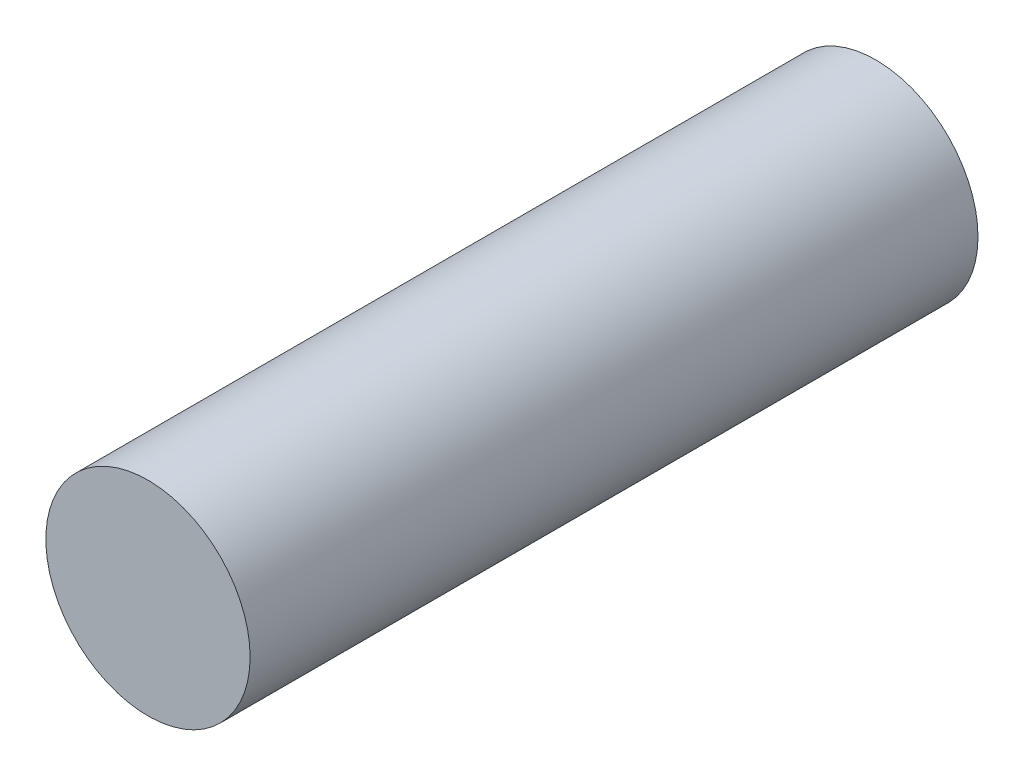
ISO-10303-21;
HEADER;
FILE_DESCRIPTION(('STEP AP214'),'2;1');
FILE_NAME('part.step','',(''),(''),'','','');
FILE_SCHEMA(('AUTOMOTIVE_DESIGN { 1 0 10303 214 1 1 1 1 }'));
ENDSEC;
DATA;
#1=APPLICATION_CONTEXT('core data for automotive mechanical design processes');
#2=APPLICATION_PROTOCOL_DEFINITION('international standard','automotive_design',2000,#1);
#3=PRODUCT_CONTEXT('',#1,'mechanical');
#4=PRODUCT('Part','Part','',(#3));
#5=PRODUCT_RELATED_PRODUCT_CATEGORY('part','',(#4));
#6=PRODUCT_DEFINITION_FORMATION('','',#4);
#7=PRODUCT_DEFINITION_CONTEXT('part definition',#1,'design');
#8=PRODUCT_DEFINITION('design','',#6,#7);
#9=PRODUCT_DEFINITION_SHAPE('','',#8);
#10=(LENGTH_UNIT() NAMED_UNIT(*) SI_UNIT(.MILLI.,.METRE.));
#11=(NAMED_UNIT(*) PLANE_ANGLE_UNIT() SI_UNIT($,.RADIAN.));
#12=(NAMED_UNIT(*) SI_UNIT($,.STERADIAN.) SOLID_ANGLE_UNIT());
#13=UNCERTAINTY_MEASURE_WITH_UNIT(LENGTH_MEASURE(1.E-05),#10,'distance_accuracy_value','');
#14=(GEOMETRIC_REPRESENTATION_CONTEXT(3) GLOBAL_UNCERTAINTY_ASSIGNED_CONTEXT((#13)) GLOBAL_UNIT_ASSIGNED_CONTEXT((#10,
#11,#12)) REPRESENTATION_CONTEXT('',''));
#15=CARTESIAN_POINT('',(0.,0.,0.));
#16=DIRECTION('',(0.,0.,1.));
#17=DIRECTION('',(1.,0.,0.));
#18=AXIS2_PLACEMENT_3D('',#15,#16,#17);
#19=CARTESIAN_POINT('',(0.,0.,64.14));
#20=DIRECTION('',(0.,0.,-1.));
#21=DIRECTION('',(-1.,0.,0.));
#22=AXIS2_PLACEMENT_3D('',#19,#20,#21);
#23=CYLINDRICAL_SURFACE('',#22,9.);
#24=CARTESIAN_POINT('',(0.,0.,64.14));
#25=DIRECTION('',(0.,0.,1.));
#26=DIRECTION('',(1.,0.,0.));
#27=AXIS2_PLACEMENT_3D('',#24,#25,#26);
#28=CIRCLE('',#27,9.);
#29=CARTESIAN_POINT('',(9.,0.,64.14));
#30=VERTEX_POINT('',#29);
#31=EDGE_CURVE('E10',#30,#30,#28,.T.);
#32=ORIENTED_EDGE('',*,*,#31,.F.);
#33=EDGE_LOOP('',(#32));
#34=FACE_BOUND('',#33,.T.);
#35=CARTESIAN_POINT('',(0.,0.,0.));
#36=DIRECTION('',(0.,0.,1.));
#37=DIRECTION('',(1.,0.,0.));
#38=AXIS2_PLACEMENT_3D('',#35,#36,#37);
#39=CIRCLE('',#38,9.);
#40=CARTESIAN_POINT('',(9.,0.,0.));
#41=VERTEX_POINT('',#40);
#42=EDGE_CURVE('E44',#41,#41,#39,.T.);
#43=ORIENTED_EDGE('',*,*,#42,.T.);
#44=EDGE_LOOP('',(#43));
#45=FACE_BOUND('',#44,.T.);
#46=ADVANCED_FACE('F45',(#34,#45),#23,.T.);
#47=CARTESIAN_POINT('',(0.,0.,64.14));
#48=DIRECTION('',(0.,0.,1.));
#49=DIRECTION('',(1.,0.,0.));
#50=AXIS2_PLACEMENT_3D('',#47,#48,#49);
#51=PLANE('',#50);
#52=ORIENTED_EDGE('',*,*,#31,.T.);
#53=EDGE_LOOP('',(#52));
#54=FACE_BOUND('',#53,.T.);
#55=ADVANCED_FACE('F60',(#54),#51,.T.);
#56=CARTESIAN_POINT('',(0.,0.,0.));
#57=DIRECTION('',(0.,0.,1.));
#58=DIRECTION('',(1.,0.,0.));
#59=AXIS2_PLACEMENT_3D('',#56,#57,#58);
#60=PLANE('',#59);
#61=ORIENTED_EDGE('',*,*,#42,.F.);
#62=EDGE_LOOP('',(#61));
#63=FACE_BOUND('',#62,.T.);
#64=ADVANCED_FACE('F54',(#63),#60,.F.);
#65=CLOSED_SHELL('',(#46,#55,#64));
#66=MANIFOLD_SOLID_BREP('B2',#65);
#67=ADVANCED_BREP_SHAPE_REPRESENTATION('',(#18,#66),#14);
#68=SHAPE_DEFINITION_REPRESENTATION(#9,#67);
ENDSEC;
END-ISO-10303-21;
